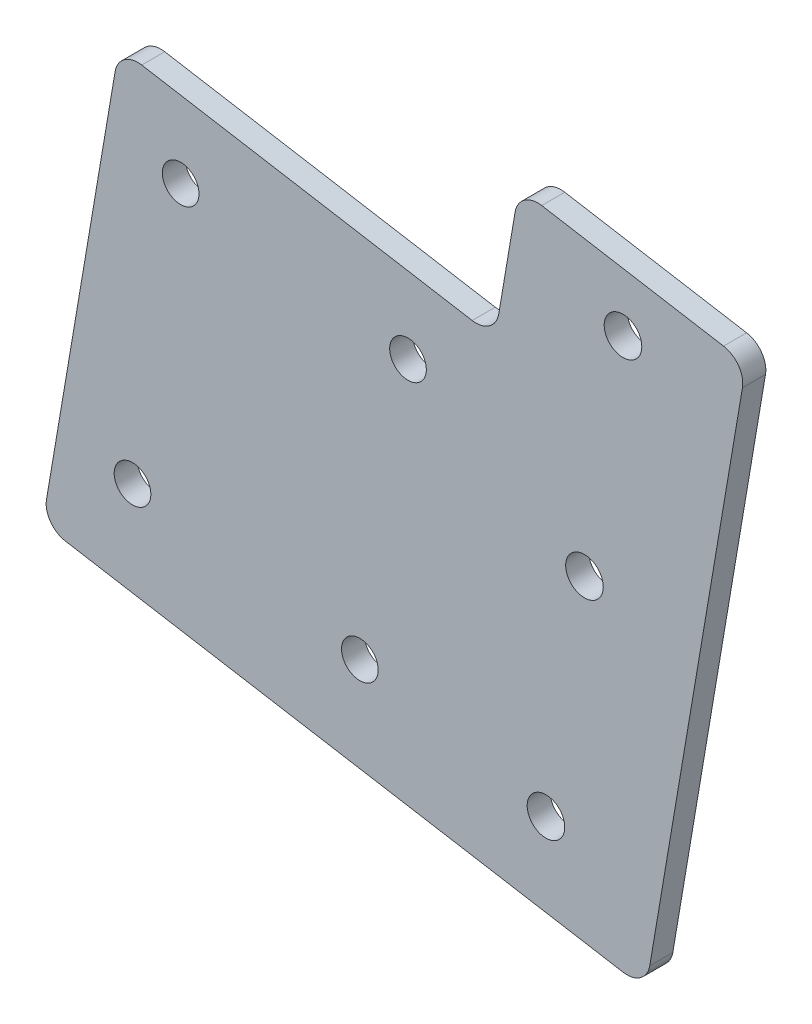
ISO-10303-21;
HEADER;
FILE_DESCRIPTION(('STEP AP214'),'2;1');
FILE_NAME('part.step','',(''),(''),'','','');
FILE_SCHEMA(('AUTOMOTIVE_DESIGN { 1 0 10303 214 1 1 1 1 }'));
ENDSEC;
DATA;
#1=APPLICATION_CONTEXT('core data for automotive mechanical design processes');
#2=APPLICATION_PROTOCOL_DEFINITION('international standard','automotive_design',2000,#1);
#3=PRODUCT_CONTEXT('',#1,'mechanical');
#4=PRODUCT('Part','Part','',(#3));
#5=PRODUCT_RELATED_PRODUCT_CATEGORY('part','',(#4));
#6=PRODUCT_DEFINITION_FORMATION('','',#4);
#7=PRODUCT_DEFINITION_CONTEXT('part definition',#1,'design');
#8=PRODUCT_DEFINITION('design','',#6,#7);
#9=PRODUCT_DEFINITION_SHAPE('','',#8);
#10=(LENGTH_UNIT() NAMED_UNIT(*) SI_UNIT(.MILLI.,.METRE.));
#11=(NAMED_UNIT(*) PLANE_ANGLE_UNIT() SI_UNIT($,.RADIAN.));
#12=(NAMED_UNIT(*) SI_UNIT($,.STERADIAN.) SOLID_ANGLE_UNIT());
#13=UNCERTAINTY_MEASURE_WITH_UNIT(LENGTH_MEASURE(1.E-05),#10,'distance_accuracy_value','');
#14=(GEOMETRIC_REPRESENTATION_CONTEXT(3) GLOBAL_UNCERTAINTY_ASSIGNED_CONTEXT((#13)) GLOBAL_UNIT_ASSIGNED_CONTEXT((#10,
#11,#12)) REPRESENTATION_CONTEXT('',''));
#15=CARTESIAN_POINT('',(0.,0.,0.));
#16=DIRECTION('',(0.,0.,1.));
#17=DIRECTION('',(1.,0.,0.));
#18=AXIS2_PLACEMENT_3D('',#15,#16,#17);
#19=CARTESIAN_POINT('',(0.,0.,2.54));
#20=DIRECTION('',(0.,0.,-1.));
#21=DIRECTION('',(-1.,0.,0.));
#22=AXIS2_PLACEMENT_3D('',#19,#20,#21);
#23=PLANE('',#22);
#24=DIRECTION('',(-0.985946796302621,0.167059614690681,0.));
#25=VECTOR('',#24,1.);
#26=CARTESIAN_POINT('',(56.1436953020657,-32.5999117817697,2.54));
#27=LINE('',#26,#25);
#28=CARTESIAN_POINT('',(53.6393904394586,-32.1755803604556,2.54));
#29=VERTEX_POINT('',#28);
#30=CARTESIAN_POINT('',(33.6049515385757,-28.7809289899387,2.54));
#31=VERTEX_POINT('',#30);
#32=EDGE_CURVE('E215',#29,#31,#27,.T.);
#33=ORIENTED_EDGE('',*,*,#32,.T.);
#34=CARTESIAN_POINT('',(33.1806201172614,-31.2852338525473,2.54));
#35=DIRECTION('',(0.,0.,-1.));
#36=DIRECTION('',(-1.,0.,0.));
#37=AXIS2_PLACEMENT_3D('',#34,#35,#36);
#38=CIRCLE('',#37,2.54);
#39=CARTESIAN_POINT('',(30.6763152546525,-30.8609024312345,2.54));
#40=VERTEX_POINT('',#39);
#41=EDGE_CURVE('E181',#31,#40,#38,.F.);
#42=ORIENTED_EDGE('',*,*,#41,.T.);
#43=DIRECTION('',(-0.167059614690076,-0.985946796302723,0.));
#44=VECTOR('',#43,1.);
#45=CARTESIAN_POINT('',(28.4498657815041,-44.0008867970124,2.54));
#46=LINE('',#45,#44);
#47=CARTESIAN_POINT('',(28.8741972028169,-41.4965819344036,2.54));
#48=VERTEX_POINT('',#47);
#49=EDGE_CURVE('E223',#40,#48,#46,.T.);
#50=ORIENTED_EDGE('',*,*,#49,.T.);
#51=CARTESIAN_POINT('',(26.369892340208,-41.0722505130908,2.54));
#52=DIRECTION('',(0.,0.,-1.));
#53=DIRECTION('',(-1.,0.,0.));
#54=AXIS2_PLACEMENT_3D('',#51,#52,#53);
#55=CIRCLE('',#54,2.54);
#56=CARTESIAN_POINT('',(25.9455609188952,-43.5765553756997,2.54));
#57=VERTEX_POINT('',#56);
#58=EDGE_CURVE('E11',#48,#57,#55,.T.);
#59=ORIENTED_EDGE('',*,*,#58,.T.);
#60=DIRECTION('',(-0.985946796302726,0.167059614690062,0.));
#61=VECTOR('',#60,1.);
#62=CARTESIAN_POINT('',(-12.9598996632079,-36.9843829800302,2.54));
#63=LINE('',#62,#61);
#64=CARTESIAN_POINT('',(-10.455594800599,-37.408714401343,2.54));
#65=VERTEX_POINT('',#64);
#66=EDGE_CURVE('E138',#57,#65,#63,.T.);
#67=ORIENTED_EDGE('',*,*,#66,.T.);
#68=CARTESIAN_POINT('',(-10.8799262219118,-39.9130192639519,2.54));
#69=DIRECTION('',(0.,0.,-1.));
#70=DIRECTION('',(-1.,0.,0.));
#71=AXIS2_PLACEMENT_3D('',#68,#69,#70);
#72=CIRCLE('',#71,2.54);
#73=CARTESIAN_POINT('',(-13.3842310845207,-39.4886878426392,2.54));
#74=VERTEX_POINT('',#73);
#75=EDGE_CURVE('E55',#65,#74,#72,.F.);
#76=ORIENTED_EDGE('',*,*,#75,.T.);
#77=DIRECTION('',(-0.167059614690061,-0.985946796302726,0.));
#78=VECTOR('',#77,1.);
#79=CARTESIAN_POINT('',(-21.3671747724863,-86.6021555039709,2.54));
#80=LINE('',#79,#78);
#81=CARTESIAN_POINT('',(-20.9428433511735,-84.097850641362,2.54));
#82=VERTEX_POINT('',#81);
#83=EDGE_CURVE('E155',#74,#82,#80,.T.);
#84=ORIENTED_EDGE('',*,*,#83,.T.);
#85=CARTESIAN_POINT('',(-18.4385384885646,-84.5221820626747,2.54));
#86=DIRECTION('',(0.,0.,-1.));
#87=DIRECTION('',(-1.,0.,0.));
#88=AXIS2_PLACEMENT_3D('',#85,#86,#87);
#89=CIRCLE('',#88,2.54);
#90=CARTESIAN_POINT('',(-18.8628699098773,-87.0264869252836,2.54));
#91=VERTEX_POINT('',#90);
#92=EDGE_CURVE('E175',#82,#91,#89,.F.);
#93=ORIENTED_EDGE('',*,*,#92,.T.);
#94=DIRECTION('',(0.985946796302726,-0.167059614690062,0.));
#95=VECTOR('',#94,1.);
#96=CARTESIAN_POINT('',(45.0856392983287,-97.861973534083,2.54));
#97=LINE('',#96,#95);
#98=CARTESIAN_POINT('',(42.5813344357198,-97.4376421127702,2.54));
#99=VERTEX_POINT('',#98);
#100=EDGE_CURVE('E149',#91,#99,#97,.T.);
#101=ORIENTED_EDGE('',*,*,#100,.T.);
#102=CARTESIAN_POINT('',(43.0056658570325,-94.9333372501613,2.54));
#103=DIRECTION('',(0.,0.,-1.));
#104=DIRECTION('',(-1.,0.,0.));
#105=AXIS2_PLACEMENT_3D('',#102,#103,#104);
#106=CIRCLE('',#105,2.54);
#107=CARTESIAN_POINT('',(45.5099707196414,-95.357668671474,2.54));
#108=VERTEX_POINT('',#107);
#109=EDGE_CURVE('E177',#99,#108,#106,.F.);
#110=ORIENTED_EDGE('',*,*,#109,.T.);
#111=DIRECTION('',(0.167059614690064,0.985946796302725,0.));
#112=VECTOR('',#111,1.);
#113=CARTESIAN_POINT('',(45.0856392983287,-97.861973534083,2.54));
#114=LINE('',#113,#112);
#115=CARTESIAN_POINT('',(55.7193638807532,-35.104216644377,2.54));
#116=VERTEX_POINT('',#115);
#117=EDGE_CURVE('E212',#108,#116,#114,.T.);
#118=ORIENTED_EDGE('',*,*,#117,.T.);
#119=CARTESIAN_POINT('',(53.2150590181443,-34.6798852230643,2.54));
#120=DIRECTION('',(0.,0.,-1.));
#121=DIRECTION('',(-1.,0.,0.));
#122=AXIS2_PLACEMENT_3D('',#119,#120,#121);
#123=CIRCLE('',#122,2.54);
#124=EDGE_CURVE('E179',#116,#29,#123,.F.);
#125=ORIENTED_EDGE('',*,*,#124,.T.);
#126=EDGE_LOOP('',(#33,#42,#50,#59,#67,#76,#84,#93,#101,#110,#118,#125));
#127=FACE_BOUND('',#126,.T.);
#128=CARTESIAN_POINT('',(-6.16313605582281,-46.5543361912704,2.54));
#129=DIRECTION('',(0.,0.,1.));
#130=DIRECTION('',(1.,0.,0.));
#131=AXIS2_PLACEMENT_3D('',#128,#129,#130);
#132=CIRCLE('',#131,2.0192999965118);
#133=CARTESIAN_POINT('',(-4.14383605931101,-46.5543361912704,2.54));
#134=VERTEX_POINT('',#133);
#135=EDGE_CURVE('E230',#134,#134,#132,.T.);
#136=ORIENTED_EDGE('',*,*,#135,.F.);
#137=EDGE_LOOP('',(#136));
#138=FACE_BOUND('',#137,.T.);
#139=CARTESIAN_POINT('',(-11.4672788222318,-77.8581469738822,2.54));
#140=DIRECTION('',(0.,0.,1.));
#141=DIRECTION('',(1.,0.,0.));
#142=AXIS2_PLACEMENT_3D('',#139,#140,#141);
#143=CIRCLE('',#142,2.01929999636841);
#144=CARTESIAN_POINT('',(-9.44797882586343,-77.8581469738822,2.54));
#145=VERTEX_POINT('',#144);
#146=EDGE_CURVE('E283',#145,#145,#143,.T.);
#147=ORIENTED_EDGE('',*,*,#146,.F.);
#148=EDGE_LOOP('',(#147));
#149=FACE_BOUND('',#148,.T.);
#150=CARTESIAN_POINT('',(18.8799125702664,-50.797650404398,2.54));
#151=DIRECTION('',(0.,0.,1.));
#152=DIRECTION('',(1.,0.,0.));
#153=AXIS2_PLACEMENT_3D('',#150,#151,#152);
#154=CIRCLE('',#153,2.01929999645455);
#155=CARTESIAN_POINT('',(20.899212566721,-50.797650404398,2.54));
#156=VERTEX_POINT('',#155);
#157=EDGE_CURVE('E289',#156,#156,#154,.T.);
#158=ORIENTED_EDGE('',*,*,#157,.F.);
#159=EDGE_LOOP('',(#158));
#160=FACE_BOUND('',#159,.T.);
#161=CARTESIAN_POINT('',(13.5757698038574,-82.1014611870097,2.54));
#162=DIRECTION('',(0.,0.,1.));
#163=DIRECTION('',(1.,0.,0.));
#164=AXIS2_PLACEMENT_3D('',#161,#162,#163);
#165=CIRCLE('',#164,2.01929999631117);
#166=CARTESIAN_POINT('',(15.5950698001685,-82.1014611870097,2.54));
#167=VERTEX_POINT('',#166);
#168=EDGE_CURVE('E295',#167,#167,#165,.T.);
#169=ORIENTED_EDGE('',*,*,#168,.F.);
#170=EDGE_LOOP('',(#169));
#171=FACE_BOUND('',#170,.T.);
#172=CARTESIAN_POINT('',(38.3180299477844,-61.7820552762504,2.54));
#173=DIRECTION('',(0.,0.,1.));
#174=DIRECTION('',(1.,0.,0.));
#175=AXIS2_PLACEMENT_3D('',#172,#173,#174);
#176=CIRCLE('',#175,2.07009999729554);
#177=CARTESIAN_POINT('',(40.3881299450799,-61.7820552762504,2.54));
#178=VERTEX_POINT('',#177);
#179=EDGE_CURVE('E301',#178,#178,#176,.T.);
#180=ORIENTED_EDGE('',*,*,#179,.F.);
#181=EDGE_LOOP('',(#180));
#182=FACE_BOUND('',#181,.T.);
#183=CARTESIAN_POINT('',(34.0747157346568,-86.8251039023394,2.54));
#184=DIRECTION('',(0.,0.,1.));
#185=DIRECTION('',(1.,0.,0.));
#186=AXIS2_PLACEMENT_3D('',#183,#184,#185);
#187=CIRCLE('',#186,2.0700999971813);
#188=CARTESIAN_POINT('',(36.1448157318381,-86.8251039023394,2.54));
#189=VERTEX_POINT('',#188);
#190=EDGE_CURVE('E307',#189,#189,#187,.T.);
#191=ORIENTED_EDGE('',*,*,#190,.F.);
#192=EDGE_LOOP('',(#191));
#193=FACE_BOUND('',#192,.T.);
#194=CARTESIAN_POINT('',(42.561344160912,-36.7390066501611,2.54));
#195=DIRECTION('',(0.,0.,1.));
#196=DIRECTION('',(1.,0.,0.));
#197=AXIS2_PLACEMENT_3D('',#194,#195,#196);
#198=CIRCLE('',#197,2.07009999740967);
#199=CARTESIAN_POINT('',(44.6314441583217,-36.7390066501611,2.54));
#200=VERTEX_POINT('',#199);
#201=EDGE_CURVE('E313',#200,#200,#198,.T.);
#202=ORIENTED_EDGE('',*,*,#201,.F.);
#203=EDGE_LOOP('',(#202));
#204=FACE_BOUND('',#203,.T.);
#205=ADVANCED_FACE('F33',(#127,#138,#149,#160,#171,#182,#193,#204),#23,.F.);
#206=CARTESIAN_POINT('',(0.,0.,0.));
#207=DIRECTION('',(0.,0.,-1.));
#208=DIRECTION('',(-1.,0.,0.));
#209=AXIS2_PLACEMENT_3D('',#206,#207,#208);
#210=PLANE('',#209);
#211=CARTESIAN_POINT('',(34.0747157346568,-86.8251039023394,0.));
#212=DIRECTION('',(0.,0.,1.));
#213=DIRECTION('',(1.,0.,0.));
#214=AXIS2_PLACEMENT_3D('',#211,#212,#213);
#215=CIRCLE('',#214,2.0700999971813);
#216=CARTESIAN_POINT('',(36.1448157318381,-86.8251039023394,0.));
#217=VERTEX_POINT('',#216);
#218=EDGE_CURVE('E310',#217,#217,#215,.T.);
#219=ORIENTED_EDGE('',*,*,#218,.T.);
#220=EDGE_LOOP('',(#219));
#221=FACE_BOUND('',#220,.T.);
#222=CARTESIAN_POINT('',(13.5757698038574,-82.1014611870097,0.));
#223=DIRECTION('',(0.,0.,1.));
#224=DIRECTION('',(1.,0.,0.));
#225=AXIS2_PLACEMENT_3D('',#222,#223,#224);
#226=CIRCLE('',#225,2.01929999631117);
#227=CARTESIAN_POINT('',(15.5950698001685,-82.1014611870097,0.));
#228=VERTEX_POINT('',#227);
#229=EDGE_CURVE('E298',#228,#228,#226,.T.);
#230=ORIENTED_EDGE('',*,*,#229,.T.);
#231=EDGE_LOOP('',(#230));
#232=FACE_BOUND('',#231,.T.);
#233=CARTESIAN_POINT('',(-11.4672788222318,-77.8581469738822,0.));
#234=DIRECTION('',(0.,0.,1.));
#235=DIRECTION('',(1.,0.,0.));
#236=AXIS2_PLACEMENT_3D('',#233,#234,#235);
#237=CIRCLE('',#236,2.01929999636841);
#238=CARTESIAN_POINT('',(-9.44797882586343,-77.8581469738822,0.));
#239=VERTEX_POINT('',#238);
#240=EDGE_CURVE('E285',#239,#239,#237,.T.);
#241=ORIENTED_EDGE('',*,*,#240,.T.);
#242=EDGE_LOOP('',(#241));
#243=FACE_BOUND('',#242,.T.);
#244=DIRECTION('',(-0.167059614690076,-0.985946796302723,0.));
#245=VECTOR('',#244,1.);
#246=CARTESIAN_POINT('',(28.4498657815041,-44.0008867970124,0.));
#247=LINE('',#246,#245);
#248=CARTESIAN_POINT('',(30.6763152546525,-30.8609024312345,0.));
#249=VERTEX_POINT('',#248);
#250=CARTESIAN_POINT('',(28.8741972028169,-41.4965819344036,0.));
#251=VERTEX_POINT('',#250);
#252=EDGE_CURVE('E147',#249,#251,#247,.T.);
#253=ORIENTED_EDGE('',*,*,#252,.F.);
#254=CARTESIAN_POINT('',(33.1806201172614,-31.2852338525473,0.));
#255=DIRECTION('',(0.,0.,-1.));
#256=DIRECTION('',(-1.,0.,0.));
#257=AXIS2_PLACEMENT_3D('',#254,#255,#256);
#258=CIRCLE('',#257,2.54);
#259=CARTESIAN_POINT('',(33.6049515385757,-28.7809289899387,0.));
#260=VERTEX_POINT('',#259);
#261=EDGE_CURVE('E167',#249,#260,#258,.T.);
#262=ORIENTED_EDGE('',*,*,#261,.T.);
#263=DIRECTION('',(-0.985946796302621,0.167059614690681,0.));
#264=VECTOR('',#263,1.);
#265=CARTESIAN_POINT('',(56.1436953020657,-32.5999117817697,0.));
#266=LINE('',#265,#264);
#267=CARTESIAN_POINT('',(53.6393904394586,-32.1755803604556,0.));
#268=VERTEX_POINT('',#267);
#269=EDGE_CURVE('E151',#268,#260,#266,.T.);
#270=ORIENTED_EDGE('',*,*,#269,.F.);
#271=CARTESIAN_POINT('',(53.2150590181443,-34.6798852230643,0.));
#272=DIRECTION('',(0.,0.,-1.));
#273=DIRECTION('',(-1.,0.,0.));
#274=AXIS2_PLACEMENT_3D('',#271,#272,#273);
#275=CIRCLE('',#274,2.54);
#276=CARTESIAN_POINT('',(55.7193638807532,-35.104216644377,0.));
#277=VERTEX_POINT('',#276);
#278=EDGE_CURVE('E165',#268,#277,#275,.T.);
#279=ORIENTED_EDGE('',*,*,#278,.T.);
#280=DIRECTION('',(0.167059614690064,0.985946796302725,0.));
#281=VECTOR('',#280,1.);
#282=CARTESIAN_POINT('',(45.0856392983287,-97.861973534083,0.));
#283=LINE('',#282,#281);
#284=CARTESIAN_POINT('',(45.5099707196414,-95.357668671474,0.));
#285=VERTEX_POINT('',#284);
#286=EDGE_CURVE('E229',#285,#277,#283,.T.);
#287=ORIENTED_EDGE('',*,*,#286,.F.);
#288=CARTESIAN_POINT('',(43.0056658570325,-94.9333372501613,0.));
#289=DIRECTION('',(0.,0.,-1.));
#290=DIRECTION('',(-1.,0.,0.));
#291=AXIS2_PLACEMENT_3D('',#288,#289,#290);
#292=CIRCLE('',#291,2.54);
#293=CARTESIAN_POINT('',(42.5813344357198,-97.4376421127702,0.));
#294=VERTEX_POINT('',#293);
#295=EDGE_CURVE('E163',#285,#294,#292,.T.);
#296=ORIENTED_EDGE('',*,*,#295,.T.);
#297=DIRECTION('',(0.985946796302726,-0.167059614690062,0.));
#298=VECTOR('',#297,1.);
#299=CARTESIAN_POINT('',(45.0856392983287,-97.861973534083,0.));
#300=LINE('',#299,#298);
#301=CARTESIAN_POINT('',(-18.8628699098773,-87.0264869252836,0.));
#302=VERTEX_POINT('',#301);
#303=EDGE_CURVE('E201',#302,#294,#300,.T.);
#304=ORIENTED_EDGE('',*,*,#303,.F.);
#305=CARTESIAN_POINT('',(-18.4385384885646,-84.5221820626747,0.));
#306=DIRECTION('',(0.,0.,-1.));
#307=DIRECTION('',(-1.,0.,0.));
#308=AXIS2_PLACEMENT_3D('',#305,#306,#307);
#309=CIRCLE('',#308,2.54);
#310=CARTESIAN_POINT('',(-20.9428433511735,-84.097850641362,0.));
#311=VERTEX_POINT('',#310);
#312=EDGE_CURVE('E161',#302,#311,#309,.T.);
#313=ORIENTED_EDGE('',*,*,#312,.T.);
#314=DIRECTION('',(-0.167059614690061,-0.985946796302726,0.));
#315=VECTOR('',#314,1.);
#316=CARTESIAN_POINT('',(-21.3671747724863,-86.6021555039709,0.));
#317=LINE('',#316,#315);
#318=CARTESIAN_POINT('',(-13.3842310845207,-39.4886878426392,0.));
#319=VERTEX_POINT('',#318);
#320=EDGE_CURVE('E146',#319,#311,#317,.T.);
#321=ORIENTED_EDGE('',*,*,#320,.F.);
#322=CARTESIAN_POINT('',(-10.8799262219118,-39.9130192639519,0.));
#323=DIRECTION('',(0.,0.,-1.));
#324=DIRECTION('',(-1.,0.,0.));
#325=AXIS2_PLACEMENT_3D('',#322,#323,#324);
#326=CIRCLE('',#325,2.54);
#327=CARTESIAN_POINT('',(-10.455594800599,-37.408714401343,0.));
#328=VERTEX_POINT('',#327);
#329=EDGE_CURVE('E145',#319,#328,#326,.T.);
#330=ORIENTED_EDGE('',*,*,#329,.T.);
#331=DIRECTION('',(-0.985946796302726,0.167059614690062,0.));
#332=VECTOR('',#331,1.);
#333=CARTESIAN_POINT('',(-12.9598996632079,-36.9843829800302,0.));
#334=LINE('',#333,#332);
#335=CARTESIAN_POINT('',(25.9455609188952,-43.5765553756997,0.));
#336=VERTEX_POINT('',#335);
#337=EDGE_CURVE('E136',#336,#328,#334,.T.);
#338=ORIENTED_EDGE('',*,*,#337,.F.);
#339=CARTESIAN_POINT('',(26.369892340208,-41.0722505130908,0.));
#340=DIRECTION('',(0.,0.,-1.));
#341=DIRECTION('',(-1.,0.,0.));
#342=AXIS2_PLACEMENT_3D('',#339,#340,#341);
#343=CIRCLE('',#342,2.54);
#344=EDGE_CURVE('E41',#336,#251,#343,.F.);
#345=ORIENTED_EDGE('',*,*,#344,.T.);
#346=EDGE_LOOP('',(#253,#262,#270,#279,#287,#296,#304,#313,#321,#330,#338,#345));
#347=FACE_BOUND('',#346,.T.);
#348=CARTESIAN_POINT('',(-6.16313605582281,-46.5543361912704,0.));
#349=DIRECTION('',(0.,0.,1.));
#350=DIRECTION('',(1.,0.,0.));
#351=AXIS2_PLACEMENT_3D('',#348,#349,#350);
#352=CIRCLE('',#351,2.0192999965118);
#353=CARTESIAN_POINT('',(-4.14383605931101,-46.5543361912704,0.));
#354=VERTEX_POINT('',#353);
#355=EDGE_CURVE('E218',#354,#354,#352,.T.);
#356=ORIENTED_EDGE('',*,*,#355,.T.);
#357=EDGE_LOOP('',(#356));
#358=FACE_BOUND('',#357,.T.);
#359=CARTESIAN_POINT('',(18.8799125702664,-50.797650404398,0.));
#360=DIRECTION('',(0.,0.,1.));
#361=DIRECTION('',(1.,0.,0.));
#362=AXIS2_PLACEMENT_3D('',#359,#360,#361);
#363=CIRCLE('',#362,2.01929999645455);
#364=CARTESIAN_POINT('',(20.899212566721,-50.797650404398,0.));
#365=VERTEX_POINT('',#364);
#366=EDGE_CURVE('E292',#365,#365,#363,.T.);
#367=ORIENTED_EDGE('',*,*,#366,.T.);
#368=EDGE_LOOP('',(#367));
#369=FACE_BOUND('',#368,.T.);
#370=CARTESIAN_POINT('',(38.3180299477844,-61.7820552762504,0.));
#371=DIRECTION('',(0.,0.,1.));
#372=DIRECTION('',(1.,0.,0.));
#373=AXIS2_PLACEMENT_3D('',#370,#371,#372);
#374=CIRCLE('',#373,2.07009999729554);
#375=CARTESIAN_POINT('',(40.3881299450799,-61.7820552762504,0.));
#376=VERTEX_POINT('',#375);
#377=EDGE_CURVE('E304',#376,#376,#374,.T.);
#378=ORIENTED_EDGE('',*,*,#377,.T.);
#379=EDGE_LOOP('',(#378));
#380=FACE_BOUND('',#379,.T.);
#381=CARTESIAN_POINT('',(42.561344160912,-36.7390066501611,0.));
#382=DIRECTION('',(0.,0.,1.));
#383=DIRECTION('',(1.,0.,0.));
#384=AXIS2_PLACEMENT_3D('',#381,#382,#383);
#385=CIRCLE('',#384,2.07009999740967);
#386=CARTESIAN_POINT('',(44.6314441583217,-36.7390066501611,0.));
#387=VERTEX_POINT('',#386);
#388=EDGE_CURVE('E316',#387,#387,#385,.T.);
#389=ORIENTED_EDGE('',*,*,#388,.T.);
#390=EDGE_LOOP('',(#389));
#391=FACE_BOUND('',#390,.T.);
#392=ADVANCED_FACE('F142',(#221,#232,#243,#347,#358,#369,#380,#391),#210,.T.);
#393=CARTESIAN_POINT('',(45.0856392983287,-97.861973534083,2.54));
#394=DIRECTION('',(0.167059614690062,0.985946796302725,0.));
#395=DIRECTION('',(-0.985946796302725,0.167059614690062,0.));
#396=AXIS2_PLACEMENT_3D('',#393,#394,#395);
#397=PLANE('',#396);
#398=ORIENTED_EDGE('',*,*,#303,.T.);
#399=DIRECTION('',(0.,0.,-1.));
#400=VECTOR('',#399,1.);
#401=CARTESIAN_POINT('',(42.5813344357198,-97.4376421127702,2.54));
#402=LINE('',#401,#400);
#403=EDGE_CURVE('E191',#294,#99,#402,.F.);
#404=ORIENTED_EDGE('',*,*,#403,.T.);
#405=ORIENTED_EDGE('',*,*,#100,.F.);
#406=DIRECTION('',(0.,0.,-1.));
#407=VECTOR('',#406,1.);
#408=CARTESIAN_POINT('',(-18.8628699098773,-87.0264869252836,2.54));
#409=LINE('',#408,#407);
#410=EDGE_CURVE('E188',#91,#302,#409,.T.);
#411=ORIENTED_EDGE('',*,*,#410,.T.);
#412=EDGE_LOOP('',(#398,#404,#405,#411));
#413=FACE_BOUND('',#412,.T.);
#414=ADVANCED_FACE('F208',(#413),#397,.F.);
#415=CARTESIAN_POINT('',(45.0856392983287,-97.861973534083,2.54));
#416=DIRECTION('',(-0.985946796302725,0.167059614690064,0.));
#417=DIRECTION('',(-0.167059614690064,-0.985946796302725,0.));
#418=AXIS2_PLACEMENT_3D('',#415,#416,#417);
#419=PLANE('',#418);
#420=ORIENTED_EDGE('',*,*,#286,.T.);
#421=DIRECTION('',(0.,0.,-1.));
#422=VECTOR('',#421,1.);
#423=CARTESIAN_POINT('',(55.7193638807532,-35.104216644377,2.54));
#424=LINE('',#423,#422);
#425=EDGE_CURVE('E186',#277,#116,#424,.F.);
#426=ORIENTED_EDGE('',*,*,#425,.T.);
#427=ORIENTED_EDGE('',*,*,#117,.F.);
#428=DIRECTION('',(0.,0.,-1.));
#429=VECTOR('',#428,1.);
#430=CARTESIAN_POINT('',(45.5099707196414,-95.357668671474,2.54));
#431=LINE('',#430,#429);
#432=EDGE_CURVE('E183',#108,#285,#431,.T.);
#433=ORIENTED_EDGE('',*,*,#432,.T.);
#434=EDGE_LOOP('',(#420,#426,#427,#433));
#435=FACE_BOUND('',#434,.T.);
#436=ADVANCED_FACE('F254',(#435),#419,.F.);
#437=CARTESIAN_POINT('',(56.1436953020657,-32.5999117817697,2.54));
#438=DIRECTION('',(-0.167059614690681,-0.985946796302621,0.));
#439=DIRECTION('',(0.985946796302621,-0.167059614690681,0.));
#440=AXIS2_PLACEMENT_3D('',#437,#438,#439);
#441=PLANE('',#440);
#442=ORIENTED_EDGE('',*,*,#269,.T.);
#443=DIRECTION('',(0.,0.,-1.));
#444=VECTOR('',#443,1.);
#445=CARTESIAN_POINT('',(33.6049515385757,-28.7809289899387,2.54));
#446=LINE('',#445,#444);
#447=EDGE_CURVE('E172',#260,#31,#446,.F.);
#448=ORIENTED_EDGE('',*,*,#447,.T.);
#449=ORIENTED_EDGE('',*,*,#32,.F.);
#450=DIRECTION('',(0.,0.,-1.));
#451=VECTOR('',#450,1.);
#452=CARTESIAN_POINT('',(53.6393904394586,-32.1755803604556,2.54));
#453=LINE('',#452,#451);
#454=EDGE_CURVE('E169',#29,#268,#453,.T.);
#455=ORIENTED_EDGE('',*,*,#454,.T.);
#456=EDGE_LOOP('',(#442,#448,#449,#455));
#457=FACE_BOUND('',#456,.T.);
#458=ADVANCED_FACE('F236',(#457),#441,.F.);
#459=CARTESIAN_POINT('',(28.4498657815041,-44.0008867970124,2.54));
#460=DIRECTION('',(0.985946796302723,-0.167059614690076,0.));
#461=DIRECTION('',(0.167059614690076,0.985946796302723,0.));
#462=AXIS2_PLACEMENT_3D('',#459,#460,#461);
#463=PLANE('',#462);
#464=ORIENTED_EDGE('',*,*,#252,.T.);
#465=DIRECTION('',(0.,0.,-1.));
#466=VECTOR('',#465,1.);
#467=CARTESIAN_POINT('',(28.8741972028169,-41.4965819344036,2.54));
#468=LINE('',#467,#466);
#469=EDGE_CURVE('E127',#251,#48,#468,.F.);
#470=ORIENTED_EDGE('',*,*,#469,.T.);
#471=ORIENTED_EDGE('',*,*,#49,.F.);
#472=DIRECTION('',(0.,0.,-1.));
#473=VECTOR('',#472,1.);
#474=CARTESIAN_POINT('',(30.6763152546525,-30.8609024312345,2.54));
#475=LINE('',#474,#473);
#476=EDGE_CURVE('E139',#40,#249,#475,.T.);
#477=ORIENTED_EDGE('',*,*,#476,.T.);
#478=EDGE_LOOP('',(#464,#470,#471,#477));
#479=FACE_BOUND('',#478,.T.);
#480=ADVANCED_FACE('F246',(#479),#463,.F.);
#481=CARTESIAN_POINT('',(-12.9598996632079,-36.9843829800302,2.54));
#482=DIRECTION('',(-0.167059614690062,-0.985946796302725,0.));
#483=DIRECTION('',(0.985946796302726,-0.167059614690062,0.));
#484=AXIS2_PLACEMENT_3D('',#481,#482,#483);
#485=PLANE('',#484);
#486=ORIENTED_EDGE('',*,*,#66,.F.);
#487=DIRECTION('',(0.,0.,-1.));
#488=VECTOR('',#487,1.);
#489=CARTESIAN_POINT('',(25.9455609188952,-43.5765553756997,0.));
#490=LINE('',#489,#488);
#491=EDGE_CURVE('E126',#57,#336,#490,.T.);
#492=ORIENTED_EDGE('',*,*,#491,.T.);
#493=ORIENTED_EDGE('',*,*,#337,.T.);
#494=DIRECTION('',(0.,0.,-1.));
#495=VECTOR('',#494,1.);
#496=CARTESIAN_POINT('',(-10.455594800599,-37.408714401343,2.54));
#497=LINE('',#496,#495);
#498=EDGE_CURVE('E140',#328,#65,#497,.F.);
#499=ORIENTED_EDGE('',*,*,#498,.T.);
#500=EDGE_LOOP('',(#486,#492,#493,#499));
#501=FACE_BOUND('',#500,.T.);
#502=ADVANCED_FACE('F135',(#501),#485,.F.);
#503=CARTESIAN_POINT('',(-21.3671747724863,-86.6021555039709,2.54));
#504=DIRECTION('',(0.985946796302726,-0.167059614690061,0.));
#505=DIRECTION('',(0.167059614690061,0.985946796302726,0.));
#506=AXIS2_PLACEMENT_3D('',#503,#504,#505);
#507=PLANE('',#506);
#508=ORIENTED_EDGE('',*,*,#320,.T.);
#509=DIRECTION('',(0.,0.,-1.));
#510=VECTOR('',#509,1.);
#511=CARTESIAN_POINT('',(-20.9428433511735,-84.097850641362,2.54));
#512=LINE('',#511,#510);
#513=EDGE_CURVE('E48',#311,#82,#512,.F.);
#514=ORIENTED_EDGE('',*,*,#513,.T.);
#515=ORIENTED_EDGE('',*,*,#83,.F.);
#516=DIRECTION('',(0.,0.,-1.));
#517=VECTOR('',#516,1.);
#518=CARTESIAN_POINT('',(-13.3842310845207,-39.4886878426392,2.54));
#519=LINE('',#518,#517);
#520=EDGE_CURVE('E193',#74,#319,#519,.T.);
#521=ORIENTED_EDGE('',*,*,#520,.T.);
#522=EDGE_LOOP('',(#508,#514,#515,#521));
#523=FACE_BOUND('',#522,.T.);
#524=ADVANCED_FACE('F197',(#523),#507,.F.);
#525=CARTESIAN_POINT('',(-6.16313605582281,-46.5543361912704,2.54));
#526=DIRECTION('',(0.,0.,-1.));
#527=DIRECTION('',(-1.,0.,0.));
#528=AXIS2_PLACEMENT_3D('',#525,#526,#527);
#529=CYLINDRICAL_SURFACE('',#528,2.0192999965118);
#530=ORIENTED_EDGE('',*,*,#135,.T.);
#531=EDGE_LOOP('',(#530));
#532=FACE_BOUND('',#531,.T.);
#533=ORIENTED_EDGE('',*,*,#355,.F.);
#534=EDGE_LOOP('',(#533));
#535=FACE_BOUND('',#534,.T.);
#536=ADVANCED_FACE('F264',(#532,#535),#529,.F.);
#537=CARTESIAN_POINT('',(-11.4672788222318,-77.8581469738822,2.54));
#538=DIRECTION('',(0.,0.,-1.));
#539=DIRECTION('',(-1.,0.,0.));
#540=AXIS2_PLACEMENT_3D('',#537,#538,#539);
#541=CYLINDRICAL_SURFACE('',#540,2.01929999636841);
#542=ORIENTED_EDGE('',*,*,#146,.T.);
#543=EDGE_LOOP('',(#542));
#544=FACE_BOUND('',#543,.T.);
#545=ORIENTED_EDGE('',*,*,#240,.F.);
#546=EDGE_LOOP('',(#545));
#547=FACE_BOUND('',#546,.T.);
#548=ADVANCED_FACE('F271',(#544,#547),#541,.F.);
#549=CARTESIAN_POINT('',(18.8799125702664,-50.797650404398,2.54));
#550=DIRECTION('',(0.,0.,-1.));
#551=DIRECTION('',(-1.,0.,0.));
#552=AXIS2_PLACEMENT_3D('',#549,#550,#551);
#553=CYLINDRICAL_SURFACE('',#552,2.01929999645455);
#554=ORIENTED_EDGE('',*,*,#157,.T.);
#555=EDGE_LOOP('',(#554));
#556=FACE_BOUND('',#555,.T.);
#557=ORIENTED_EDGE('',*,*,#366,.F.);
#558=EDGE_LOOP('',(#557));
#559=FACE_BOUND('',#558,.T.);
#560=ADVANCED_FACE('F276',(#556,#559),#553,.F.);
#561=CARTESIAN_POINT('',(13.5757698038574,-82.1014611870097,2.54));
#562=DIRECTION('',(0.,0.,-1.));
#563=DIRECTION('',(-1.,0.,0.));
#564=AXIS2_PLACEMENT_3D('',#561,#562,#563);
#565=CYLINDRICAL_SURFACE('',#564,2.01929999631117);
#566=ORIENTED_EDGE('',*,*,#168,.T.);
#567=EDGE_LOOP('',(#566));
#568=FACE_BOUND('',#567,.T.);
#569=ORIENTED_EDGE('',*,*,#229,.F.);
#570=EDGE_LOOP('',(#569));
#571=FACE_BOUND('',#570,.T.);
#572=ADVANCED_FACE('F341',(#568,#571),#565,.F.);
#573=CARTESIAN_POINT('',(38.3180299477844,-61.7820552762504,2.54));
#574=DIRECTION('',(0.,0.,-1.));
#575=DIRECTION('',(-1.,0.,0.));
#576=AXIS2_PLACEMENT_3D('',#573,#574,#575);
#577=CYLINDRICAL_SURFACE('',#576,2.07009999729554);
#578=ORIENTED_EDGE('',*,*,#179,.T.);
#579=EDGE_LOOP('',(#578));
#580=FACE_BOUND('',#579,.T.);
#581=ORIENTED_EDGE('',*,*,#377,.F.);
#582=EDGE_LOOP('',(#581));
#583=FACE_BOUND('',#582,.T.);
#584=ADVANCED_FACE('F335',(#580,#583),#577,.F.);
#585=CARTESIAN_POINT('',(34.0747157346568,-86.8251039023394,2.54));
#586=DIRECTION('',(0.,0.,-1.));
#587=DIRECTION('',(-1.,0.,0.));
#588=AXIS2_PLACEMENT_3D('',#585,#586,#587);
#589=CYLINDRICAL_SURFACE('',#588,2.0700999971813);
#590=ORIENTED_EDGE('',*,*,#190,.T.);
#591=EDGE_LOOP('',(#590));
#592=FACE_BOUND('',#591,.T.);
#593=ORIENTED_EDGE('',*,*,#218,.F.);
#594=EDGE_LOOP('',(#593));
#595=FACE_BOUND('',#594,.T.);
#596=ADVANCED_FACE('F326',(#592,#595),#589,.F.);
#597=CARTESIAN_POINT('',(42.561344160912,-36.7390066501611,2.54));
#598=DIRECTION('',(0.,0.,-1.));
#599=DIRECTION('',(-1.,0.,0.));
#600=AXIS2_PLACEMENT_3D('',#597,#598,#599);
#601=CYLINDRICAL_SURFACE('',#600,2.07009999740967);
#602=ORIENTED_EDGE('',*,*,#201,.T.);
#603=EDGE_LOOP('',(#602));
#604=FACE_BOUND('',#603,.T.);
#605=ORIENTED_EDGE('',*,*,#388,.F.);
#606=EDGE_LOOP('',(#605));
#607=FACE_BOUND('',#606,.T.);
#608=ADVANCED_FACE('F322',(#604,#607),#601,.F.);
#609=CARTESIAN_POINT('',(26.369892340208,-41.0722505130908,2.54));
#610=DIRECTION('',(0.,0.,1.));
#611=DIRECTION('',(1.,0.,0.));
#612=AXIS2_PLACEMENT_3D('',#609,#610,#611);
#613=CYLINDRICAL_SURFACE('',#612,2.54);
#614=ORIENTED_EDGE('',*,*,#58,.F.);
#615=ORIENTED_EDGE('',*,*,#469,.F.);
#616=ORIENTED_EDGE('',*,*,#344,.F.);
#617=ORIENTED_EDGE('',*,*,#491,.F.);
#618=EDGE_LOOP('',(#614,#615,#616,#617));
#619=FACE_BOUND('',#618,.T.);
#620=ADVANCED_FACE('F125',(#619),#613,.F.);
#621=CARTESIAN_POINT('',(33.1806201172614,-31.2852338525473,2.54));
#622=DIRECTION('',(0.,0.,-1.));
#623=DIRECTION('',(-1.,0.,0.));
#624=AXIS2_PLACEMENT_3D('',#621,#622,#623);
#625=CYLINDRICAL_SURFACE('',#624,2.54);
#626=ORIENTED_EDGE('',*,*,#41,.F.);
#627=ORIENTED_EDGE('',*,*,#447,.F.);
#628=ORIENTED_EDGE('',*,*,#261,.F.);
#629=ORIENTED_EDGE('',*,*,#476,.F.);
#630=EDGE_LOOP('',(#626,#627,#628,#629));
#631=FACE_BOUND('',#630,.T.);
#632=ADVANCED_FACE('F241',(#631),#625,.T.);
#633=CARTESIAN_POINT('',(53.2150590181443,-34.6798852230643,2.54));
#634=DIRECTION('',(0.,0.,-1.));
#635=DIRECTION('',(-1.,0.,0.));
#636=AXIS2_PLACEMENT_3D('',#633,#634,#635);
#637=CYLINDRICAL_SURFACE('',#636,2.54);
#638=ORIENTED_EDGE('',*,*,#124,.F.);
#639=ORIENTED_EDGE('',*,*,#425,.F.);
#640=ORIENTED_EDGE('',*,*,#278,.F.);
#641=ORIENTED_EDGE('',*,*,#454,.F.);
#642=EDGE_LOOP('',(#638,#639,#640,#641));
#643=FACE_BOUND('',#642,.T.);
#644=ADVANCED_FACE('F453',(#643),#637,.T.);
#645=CARTESIAN_POINT('',(43.0056658570325,-94.9333372501613,2.54));
#646=DIRECTION('',(0.,0.,-1.));
#647=DIRECTION('',(-1.,0.,0.));
#648=AXIS2_PLACEMENT_3D('',#645,#646,#647);
#649=CYLINDRICAL_SURFACE('',#648,2.54);
#650=ORIENTED_EDGE('',*,*,#109,.F.);
#651=ORIENTED_EDGE('',*,*,#403,.F.);
#652=ORIENTED_EDGE('',*,*,#295,.F.);
#653=ORIENTED_EDGE('',*,*,#432,.F.);
#654=EDGE_LOOP('',(#650,#651,#652,#653));
#655=FACE_BOUND('',#654,.T.);
#656=ADVANCED_FACE('F462',(#655),#649,.T.);
#657=CARTESIAN_POINT('',(-18.4385384885646,-84.5221820626747,2.54));
#658=DIRECTION('',(0.,0.,-1.));
#659=DIRECTION('',(-1.,0.,0.));
#660=AXIS2_PLACEMENT_3D('',#657,#658,#659);
#661=CYLINDRICAL_SURFACE('',#660,2.54);
#662=ORIENTED_EDGE('',*,*,#92,.F.);
#663=ORIENTED_EDGE('',*,*,#513,.F.);
#664=ORIENTED_EDGE('',*,*,#312,.F.);
#665=ORIENTED_EDGE('',*,*,#410,.F.);
#666=EDGE_LOOP('',(#662,#663,#664,#665));
#667=FACE_BOUND('',#666,.T.);
#668=ADVANCED_FACE('F205',(#667),#661,.T.);
#669=CARTESIAN_POINT('',(-10.8799262219118,-39.9130192639519,2.54));
#670=DIRECTION('',(0.,0.,-1.));
#671=DIRECTION('',(-1.,0.,0.));
#672=AXIS2_PLACEMENT_3D('',#669,#670,#671);
#673=CYLINDRICAL_SURFACE('',#672,2.54);
#674=ORIENTED_EDGE('',*,*,#75,.F.);
#675=ORIENTED_EDGE('',*,*,#498,.F.);
#676=ORIENTED_EDGE('',*,*,#329,.F.);
#677=ORIENTED_EDGE('',*,*,#520,.F.);
#678=EDGE_LOOP('',(#674,#675,#676,#677));
#679=FACE_BOUND('',#678,.T.);
#680=ADVANCED_FACE('F35',(#679),#673,.T.);
#681=CLOSED_SHELL('',(#205,#392,#414,#436,#458,#480,#502,#524,#536,#548,#560,#572,#584,#596,
#608,#620,#632,#644,#656,#668,#680));
#682=MANIFOLD_SOLID_BREP('B2',#681);
#683=ADVANCED_BREP_SHAPE_REPRESENTATION('',(#18,#682),#14);
#684=SHAPE_DEFINITION_REPRESENTATION(#9,#683);
ENDSEC;
END-ISO-10303-21;
